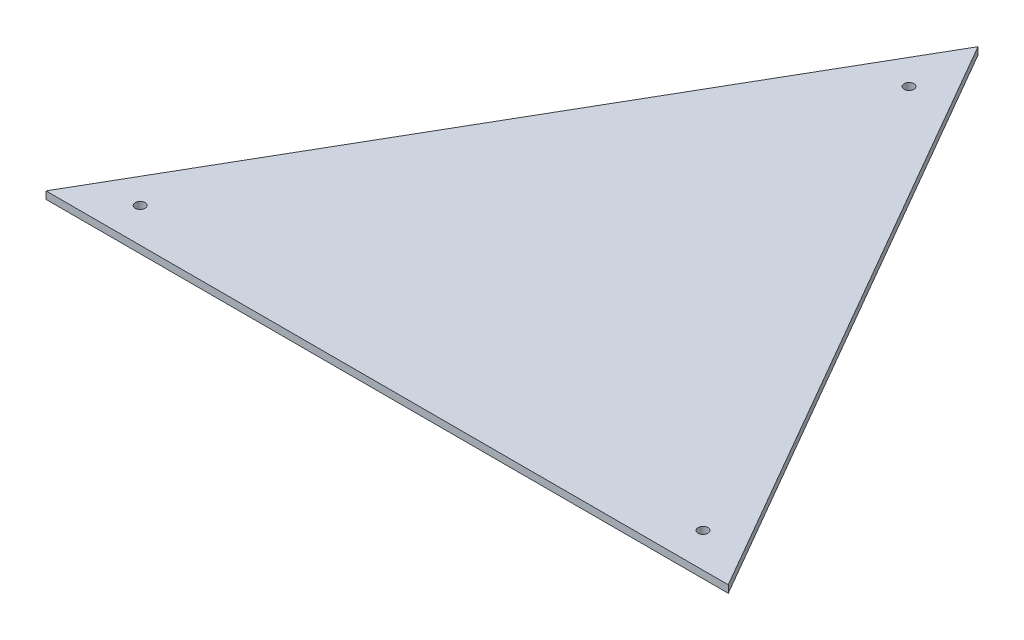
ISO-10303-21;
HEADER;
FILE_DESCRIPTION(('STEP AP214'),'2;1');
FILE_NAME('part.step','',(''),(''),'','','');
FILE_SCHEMA(('AUTOMOTIVE_DESIGN { 1 0 10303 214 1 1 1 1 }'));
ENDSEC;
DATA;
#1=APPLICATION_CONTEXT('core data for automotive mechanical design processes');
#2=APPLICATION_PROTOCOL_DEFINITION('international standard','automotive_design',2000,#1);
#3=PRODUCT_CONTEXT('',#1,'mechanical');
#4=PRODUCT('Part','Part','',(#3));
#5=PRODUCT_RELATED_PRODUCT_CATEGORY('part','',(#4));
#6=PRODUCT_DEFINITION_FORMATION('','',#4);
#7=PRODUCT_DEFINITION_CONTEXT('part definition',#1,'design');
#8=PRODUCT_DEFINITION('design','',#6,#7);
#9=PRODUCT_DEFINITION_SHAPE('','',#8);
#10=(LENGTH_UNIT() NAMED_UNIT(*) SI_UNIT(.MILLI.,.METRE.));
#11=(NAMED_UNIT(*) PLANE_ANGLE_UNIT() SI_UNIT($,.RADIAN.));
#12=(NAMED_UNIT(*) SI_UNIT($,.STERADIAN.) SOLID_ANGLE_UNIT());
#13=UNCERTAINTY_MEASURE_WITH_UNIT(LENGTH_MEASURE(1.E-05),#10,'distance_accuracy_value','');
#14=(GEOMETRIC_REPRESENTATION_CONTEXT(3) GLOBAL_UNCERTAINTY_ASSIGNED_CONTEXT((#13)) GLOBAL_UNIT_ASSIGNED_CONTEXT((#10,
#11,#12)) REPRESENTATION_CONTEXT('',''));
#15=CARTESIAN_POINT('',(0.,0.,0.));
#16=DIRECTION('',(0.,0.,1.));
#17=DIRECTION('',(1.,0.,0.));
#18=AXIS2_PLACEMENT_3D('',#15,#16,#17);
#19=CARTESIAN_POINT('',(219.970452561245,4.7625,126.999999999996));
#20=DIRECTION('',(-0.866025403784436,0.,0.500000000000004));
#21=DIRECTION('',(0.500000000000004,0.,0.866025403784436));
#22=AXIS2_PLACEMENT_3D('',#19,#20,#21);
#23=PLANE('',#22);
#24=DIRECTION('',(-0.500000000000004,0.,-0.866025403784436));
#25=VECTOR('',#24,1.);
#26=CARTESIAN_POINT('',(219.970452561245,0.,126.999999999996));
#27=LINE('',#26,#25);
#28=CARTESIAN_POINT('',(219.970452561245,0.,126.999999999996));
#29=VERTEX_POINT('',#28);
#30=CARTESIAN_POINT('',(0.,0.,-253.999999999996));
#31=VERTEX_POINT('',#30);
#32=EDGE_CURVE('E81',#29,#31,#27,.T.);
#33=ORIENTED_EDGE('',*,*,#32,.T.);
#34=DIRECTION('',(0.,-1.,0.));
#35=VECTOR('',#34,1.);
#36=CARTESIAN_POINT('',(0.,4.7625,-253.999999999996));
#37=LINE('',#36,#35);
#38=CARTESIAN_POINT('',(0.,4.7625,-253.999999999996));
#39=VERTEX_POINT('',#38);
#40=EDGE_CURVE('E11',#39,#31,#37,.T.);
#41=ORIENTED_EDGE('',*,*,#40,.F.);
#42=DIRECTION('',(-0.500000000000004,0.,-0.866025403784436));
#43=VECTOR('',#42,1.);
#44=CARTESIAN_POINT('',(219.970452561245,4.7625,126.999999999996));
#45=LINE('',#44,#43);
#46=CARTESIAN_POINT('',(219.970452561245,4.7625,126.999999999996));
#47=VERTEX_POINT('',#46);
#48=EDGE_CURVE('E74',#47,#39,#45,.T.);
#49=ORIENTED_EDGE('',*,*,#48,.F.);
#50=DIRECTION('',(0.,-1.,0.));
#51=VECTOR('',#50,1.);
#52=CARTESIAN_POINT('',(219.970452561245,4.7625,126.999999999996));
#53=LINE('',#52,#51);
#54=EDGE_CURVE('E82',#47,#29,#53,.T.);
#55=ORIENTED_EDGE('',*,*,#54,.T.);
#56=EDGE_LOOP('',(#33,#41,#49,#55));
#57=FACE_BOUND('',#56,.T.);
#58=ADVANCED_FACE('F34',(#57),#23,.F.);
#59=CARTESIAN_POINT('',(0.,4.7625,-253.999999999996));
#60=DIRECTION('',(0.86602540378444,0.,0.499999999999998));
#61=DIRECTION('',(0.499999999999998,0.,-0.86602540378444));
#62=AXIS2_PLACEMENT_3D('',#59,#60,#61);
#63=PLANE('',#62);
#64=DIRECTION('',(-0.499999999999998,0.,0.86602540378444));
#65=VECTOR('',#64,1.);
#66=CARTESIAN_POINT('',(0.,0.,-253.999999999996));
#67=LINE('',#66,#65);
#68=CARTESIAN_POINT('',(-219.970452561243,0.,126.999999999999));
#69=VERTEX_POINT('',#68);
#70=EDGE_CURVE('E62',#31,#69,#67,.T.);
#71=ORIENTED_EDGE('',*,*,#70,.T.);
#72=DIRECTION('',(0.,-1.,0.));
#73=VECTOR('',#72,1.);
#74=CARTESIAN_POINT('',(-219.970452561243,4.7625,126.999999999999));
#75=LINE('',#74,#73);
#76=CARTESIAN_POINT('',(-219.970452561243,4.7625,126.999999999999));
#77=VERTEX_POINT('',#76);
#78=EDGE_CURVE('E42',#77,#69,#75,.T.);
#79=ORIENTED_EDGE('',*,*,#78,.F.);
#80=DIRECTION('',(-0.499999999999998,0.,0.86602540378444));
#81=VECTOR('',#80,1.);
#82=CARTESIAN_POINT('',(0.,4.7625,-253.999999999996));
#83=LINE('',#82,#81);
#84=EDGE_CURVE('E70',#39,#77,#83,.T.);
#85=ORIENTED_EDGE('',*,*,#84,.F.);
#86=ORIENTED_EDGE('',*,*,#40,.T.);
#87=EDGE_LOOP('',(#71,#79,#85,#86));
#88=FACE_BOUND('',#87,.T.);
#89=ADVANCED_FACE('F71',(#88),#63,.F.);
#90=CARTESIAN_POINT('',(-219.970452561243,4.7625,126.999999999999));
#91=DIRECTION('',(0.,0.,-1.));
#92=DIRECTION('',(-1.,0.,0.));
#93=AXIS2_PLACEMENT_3D('',#90,#91,#92);
#94=PLANE('',#93);
#95=DIRECTION('',(1.,0.,0.));
#96=VECTOR('',#95,1.);
#97=CARTESIAN_POINT('',(-219.970452561243,0.,126.999999999999));
#98=LINE('',#97,#96);
#99=EDGE_CURVE('E67',#69,#29,#98,.T.);
#100=ORIENTED_EDGE('',*,*,#99,.T.);
#101=ORIENTED_EDGE('',*,*,#54,.F.);
#102=DIRECTION('',(1.,0.,0.));
#103=VECTOR('',#102,1.);
#104=CARTESIAN_POINT('',(-219.970452561243,4.7625,126.999999999999));
#105=LINE('',#104,#103);
#106=EDGE_CURVE('E50',#77,#47,#105,.T.);
#107=ORIENTED_EDGE('',*,*,#106,.F.);
#108=ORIENTED_EDGE('',*,*,#78,.T.);
#109=EDGE_LOOP('',(#100,#101,#107,#108));
#110=FACE_BOUND('',#109,.T.);
#111=ADVANCED_FACE('F93',(#110),#94,.F.);
#112=CARTESIAN_POINT('',(0.,4.7625,0.));
#113=DIRECTION('',(0.,1.,0.));
#114=DIRECTION('',(0.,0.,1.));
#115=AXIS2_PLACEMENT_3D('',#112,#113,#114);
#116=PLANE('',#115);
#117=CARTESIAN_POINT('',(1.19002030452009E-12,4.7625,-209.549999999998));
#118=DIRECTION('',(0.,1.,0.));
#119=DIRECTION('',(0.,0.,1.));
#120=AXIS2_PLACEMENT_3D('',#117,#118,#119);
#121=CIRCLE('',#120,3.175);
#122=CARTESIAN_POINT('',(1.19002030452009E-12,4.7625,-206.374999999998));
#123=VERTEX_POINT('',#122);
#124=EDGE_CURVE('E88',#123,#123,#121,.T.);
#125=ORIENTED_EDGE('',*,*,#124,.F.);
#126=EDGE_LOOP('',(#125));
#127=FACE_BOUND('',#126,.T.);
#128=CARTESIAN_POINT('',(-181.475623363026,4.7625,104.774999999999));
#129=DIRECTION('',(0.,1.,0.));
#130=DIRECTION('',(0.,0.,1.));
#131=AXIS2_PLACEMENT_3D('',#128,#129,#130);
#132=CIRCLE('',#131,3.175);
#133=CARTESIAN_POINT('',(-181.475623363026,4.7625,107.949999999999));
#134=VERTEX_POINT('',#133);
#135=EDGE_CURVE('E163',#134,#134,#132,.T.);
#136=ORIENTED_EDGE('',*,*,#135,.F.);
#137=EDGE_LOOP('',(#136));
#138=FACE_BOUND('',#137,.T.);
#139=CARTESIAN_POINT('',(181.475623363029,4.7625,104.774999999999));
#140=DIRECTION('',(0.,1.,0.));
#141=DIRECTION('',(0.,0.,1.));
#142=AXIS2_PLACEMENT_3D('',#139,#140,#141);
#143=CIRCLE('',#142,3.175);
#144=CARTESIAN_POINT('',(181.475623363029,4.7625,107.949999999999));
#145=VERTEX_POINT('',#144);
#146=EDGE_CURVE('E171',#145,#145,#143,.T.);
#147=ORIENTED_EDGE('',*,*,#146,.F.);
#148=EDGE_LOOP('',(#147));
#149=FACE_BOUND('',#148,.T.);
#150=ORIENTED_EDGE('',*,*,#48,.T.);
#151=ORIENTED_EDGE('',*,*,#84,.T.);
#152=ORIENTED_EDGE('',*,*,#106,.T.);
#153=EDGE_LOOP('',(#150,#151,#152));
#154=FACE_BOUND('',#153,.T.);
#155=ADVANCED_FACE('F77',(#127,#138,#149,#154),#116,.T.);
#156=CARTESIAN_POINT('',(0.,0.,0.));
#157=DIRECTION('',(0.,1.,0.));
#158=DIRECTION('',(0.,0.,1.));
#159=AXIS2_PLACEMENT_3D('',#156,#157,#158);
#160=PLANE('',#159);
#161=CARTESIAN_POINT('',(1.19002030452009E-12,0.,-209.549999999998));
#162=DIRECTION('',(0.,1.,0.));
#163=DIRECTION('',(0.,0.,1.));
#164=AXIS2_PLACEMENT_3D('',#161,#162,#163);
#165=CIRCLE('',#164,3.175);
#166=CARTESIAN_POINT('',(1.19002030452009E-12,0.,-206.374999999998));
#167=VERTEX_POINT('',#166);
#168=EDGE_CURVE('E84',#167,#167,#165,.T.);
#169=ORIENTED_EDGE('',*,*,#168,.T.);
#170=EDGE_LOOP('',(#169));
#171=FACE_BOUND('',#170,.T.);
#172=CARTESIAN_POINT('',(-181.475623363026,0.,104.774999999999));
#173=DIRECTION('',(0.,1.,0.));
#174=DIRECTION('',(0.,0.,1.));
#175=AXIS2_PLACEMENT_3D('',#172,#173,#174);
#176=CIRCLE('',#175,3.175);
#177=CARTESIAN_POINT('',(-181.475623363026,0.,107.949999999999));
#178=VERTEX_POINT('',#177);
#179=EDGE_CURVE('E160',#178,#178,#176,.T.);
#180=ORIENTED_EDGE('',*,*,#179,.T.);
#181=EDGE_LOOP('',(#180));
#182=FACE_BOUND('',#181,.T.);
#183=CARTESIAN_POINT('',(181.475623363029,0.,104.774999999999));
#184=DIRECTION('',(0.,1.,0.));
#185=DIRECTION('',(0.,0.,1.));
#186=AXIS2_PLACEMENT_3D('',#183,#184,#185);
#187=CIRCLE('',#186,3.175);
#188=CARTESIAN_POINT('',(181.475623363029,0.,107.949999999999));
#189=VERTEX_POINT('',#188);
#190=EDGE_CURVE('E168',#189,#189,#187,.T.);
#191=ORIENTED_EDGE('',*,*,#190,.T.);
#192=EDGE_LOOP('',(#191));
#193=FACE_BOUND('',#192,.T.);
#194=ORIENTED_EDGE('',*,*,#32,.F.);
#195=ORIENTED_EDGE('',*,*,#99,.F.);
#196=ORIENTED_EDGE('',*,*,#70,.F.);
#197=EDGE_LOOP('',(#194,#195,#196));
#198=FACE_BOUND('',#197,.T.);
#199=ADVANCED_FACE('F94',(#171,#182,#193,#198),#160,.F.);
#200=CARTESIAN_POINT('',(181.475623363029,0.,104.774999999999));
#201=DIRECTION('',(0.,1.,0.));
#202=DIRECTION('',(0.,0.,1.));
#203=AXIS2_PLACEMENT_3D('',#200,#201,#202);
#204=CYLINDRICAL_SURFACE('',#203,3.175);
#205=CARTESIAN_POINT('',(181.475623363029,0.,107.949999999999));
#206=CARTESIAN_POINT('',(181.475623363029,0.049609375,107.949999999999));
#207=CARTESIAN_POINT('',(181.475623363029,0.09921875,107.949999999999));
#208=CARTESIAN_POINT('',(181.475623363029,0.1984375,107.949999999999));
#209=CARTESIAN_POINT('',(181.475623363029,0.248046875,107.949999999999));
#210=CARTESIAN_POINT('',(181.475623363029,0.347265625,107.949999999999));
#211=CARTESIAN_POINT('',(181.475623363029,0.396875,107.949999999999));
#212=CARTESIAN_POINT('',(181.475623363029,0.49609375,107.949999999999));
#213=CARTESIAN_POINT('',(181.475623363029,0.545703125,107.949999999999));
#214=CARTESIAN_POINT('',(181.475623363029,0.644921875,107.949999999999));
#215=CARTESIAN_POINT('',(181.475623363029,0.69453125,107.949999999999));
#216=CARTESIAN_POINT('',(181.475623363029,0.79375,107.949999999999));
#217=CARTESIAN_POINT('',(181.475623363029,0.843359375,107.949999999999));
#218=CARTESIAN_POINT('',(181.475623363029,0.942578125,107.949999999999));
#219=CARTESIAN_POINT('',(181.475623363029,0.9921875,107.949999999999));
#220=CARTESIAN_POINT('',(181.475623363029,1.09140625,107.949999999999));
#221=CARTESIAN_POINT('',(181.475623363029,1.141015625,107.949999999999));
#222=CARTESIAN_POINT('',(181.475623363029,1.240234375,107.949999999999));
#223=CARTESIAN_POINT('',(181.475623363029,1.28984375,107.949999999999));
#224=CARTESIAN_POINT('',(181.475623363029,1.3890625,107.949999999999));
#225=CARTESIAN_POINT('',(181.475623363029,1.438671875,107.949999999999));
#226=CARTESIAN_POINT('',(181.475623363029,1.537890625,107.949999999999));
#227=CARTESIAN_POINT('',(181.475623363029,1.5875,107.949999999999));
#228=CARTESIAN_POINT('',(181.475623363029,1.68671875,107.949999999999));
#229=CARTESIAN_POINT('',(181.475623363029,1.736328125,107.949999999999));
#230=CARTESIAN_POINT('',(181.475623363029,1.835546875,107.949999999999));
#231=CARTESIAN_POINT('',(181.475623363029,1.88515625,107.949999999999));
#232=CARTESIAN_POINT('',(181.475623363029,1.984375,107.949999999999));
#233=CARTESIAN_POINT('',(181.475623363029,2.033984375,107.949999999999));
#234=CARTESIAN_POINT('',(181.475623363029,2.133203125,107.949999999999));
#235=CARTESIAN_POINT('',(181.475623363029,2.1828125,107.949999999999));
#236=CARTESIAN_POINT('',(181.475623363029,2.28203125,107.949999999999));
#237=CARTESIAN_POINT('',(181.475623363029,2.331640625,107.949999999999));
#238=CARTESIAN_POINT('',(181.475623363029,2.430859375,107.949999999999));
#239=CARTESIAN_POINT('',(181.475623363029,2.48046875,107.949999999999));
#240=CARTESIAN_POINT('',(181.475623363029,2.5796875,107.949999999999));
#241=CARTESIAN_POINT('',(181.475623363029,2.629296875,107.949999999999));
#242=CARTESIAN_POINT('',(181.475623363029,2.728515625,107.949999999999));
#243=CARTESIAN_POINT('',(181.475623363029,2.778125,107.949999999999));
#244=CARTESIAN_POINT('',(181.475623363029,2.87734375,107.949999999999));
#245=CARTESIAN_POINT('',(181.475623363029,2.926953125,107.949999999999));
#246=CARTESIAN_POINT('',(181.475623363029,3.026171875,107.949999999999));
#247=CARTESIAN_POINT('',(181.475623363029,3.07578125,107.949999999999));
#248=CARTESIAN_POINT('',(181.475623363029,3.175,107.949999999999));
#249=CARTESIAN_POINT('',(181.475623363029,3.224609375,107.949999999999));
#250=CARTESIAN_POINT('',(181.475623363029,3.323828125,107.949999999999));
#251=CARTESIAN_POINT('',(181.475623363029,3.3734375,107.949999999999));
#252=CARTESIAN_POINT('',(181.475623363029,3.47265625,107.949999999999));
#253=CARTESIAN_POINT('',(181.475623363029,3.522265625,107.949999999999));
#254=CARTESIAN_POINT('',(181.475623363029,3.621484375,107.949999999999));
#255=CARTESIAN_POINT('',(181.475623363029,3.67109375,107.949999999999));
#256=CARTESIAN_POINT('',(181.475623363029,3.7703125,107.949999999999));
#257=CARTESIAN_POINT('',(181.475623363029,3.819921875,107.949999999999));
#258=CARTESIAN_POINT('',(181.475623363029,3.919140625,107.949999999999));
#259=CARTESIAN_POINT('',(181.475623363029,3.96875,107.949999999999));
#260=CARTESIAN_POINT('',(181.475623363029,4.06796875,107.949999999999));
#261=CARTESIAN_POINT('',(181.475623363029,4.117578125,107.949999999999));
#262=CARTESIAN_POINT('',(181.475623363029,4.216796875,107.949999999999));
#263=CARTESIAN_POINT('',(181.475623363029,4.26640625,107.949999999999));
#264=CARTESIAN_POINT('',(181.475623363029,4.365625,107.949999999999));
#265=CARTESIAN_POINT('',(181.475623363029,4.415234375,107.949999999999));
#266=CARTESIAN_POINT('',(181.475623363029,4.514453125,107.949999999999));
#267=CARTESIAN_POINT('',(181.475623363029,4.5640625,107.949999999999));
#268=CARTESIAN_POINT('',(181.475623363029,4.66328125,107.949999999999));
#269=CARTESIAN_POINT('',(181.475623363029,4.712890625,107.949999999999));
#270=CARTESIAN_POINT('',(181.475623363029,4.7625,107.949999999999));
#271=B_SPLINE_CURVE_WITH_KNOTS('',3,(#205,#206,#207,#208,#209,#210,#211,#212,#213,#214,#215,
#216,#217,#218,#219,#220,#221,#222,#223,#224,#225,#226,#227,#228,#229,#230,#231,#232,#233,#234,
#235,#236,#237,#238,#239,#240,#241,#242,#243,#244,#245,#246,#247,#248,#249,#250,#251,#252,#253,
#254,#255,#256,#257,#258,#259,#260,#261,#262,#263,#264,#265,#266,#267,#268,#269,#270),
.UNSPECIFIED.,.F.,.F.,(4,2,2,2,2,2,2,2,2,2,2,2,2,2,2,2,2,2,2,2,2,2,2,2,2,2,2,2,2,2,2,2,4),(0.,
0.148828125,0.29765625,0.446484375,0.5953125,0.744140625,0.89296875,1.041796875,1.190625,
1.339453125,1.48828125,1.637109375,1.7859375,1.934765625,2.08359375,2.232421875,2.38125,
2.530078125,2.67890625,2.827734375,2.9765625,3.125390625,3.27421875,3.423046875,3.571875,
3.720703125,3.86953125,4.018359375,4.1671875,4.316015625,4.46484375,4.613671875,4.7625),.UNSPECIFIED.);
#272=EDGE_CURVE('BSEAM96',#189,#145,#271,.T.);
#273=ORIENTED_EDGE('',*,*,#190,.F.);
#274=ORIENTED_EDGE('',*,*,#146,.T.);
#275=ORIENTED_EDGE('',*,*,#272,.T.);
#276=ORIENTED_EDGE('',*,*,#272,.F.);
#277=EDGE_LOOP('',(#273,#275,#274,#276));
#278=FACE_BOUND('',#277,.T.);
#279=ADVANCED_FACE('F96',(#278),#204,.F.);
#280=CARTESIAN_POINT('',(-181.475623363026,0.,104.774999999999));
#281=DIRECTION('',(0.,1.,0.));
#282=DIRECTION('',(0.,0.,1.));
#283=AXIS2_PLACEMENT_3D('',#280,#281,#282);
#284=CYLINDRICAL_SURFACE('',#283,3.175);
#285=CARTESIAN_POINT('',(-181.475623363026,0.,107.949999999999));
#286=CARTESIAN_POINT('',(-181.475623363026,0.049609375,107.949999999999));
#287=CARTESIAN_POINT('',(-181.475623363026,0.09921875,107.949999999999));
#288=CARTESIAN_POINT('',(-181.475623363026,0.1984375,107.949999999999));
#289=CARTESIAN_POINT('',(-181.475623363026,0.248046875,107.949999999999));
#290=CARTESIAN_POINT('',(-181.475623363026,0.347265625,107.949999999999));
#291=CARTESIAN_POINT('',(-181.475623363026,0.396875,107.949999999999));
#292=CARTESIAN_POINT('',(-181.475623363026,0.49609375,107.949999999999));
#293=CARTESIAN_POINT('',(-181.475623363026,0.545703125,107.949999999999));
#294=CARTESIAN_POINT('',(-181.475623363026,0.644921875,107.949999999999));
#295=CARTESIAN_POINT('',(-181.475623363026,0.69453125,107.949999999999));
#296=CARTESIAN_POINT('',(-181.475623363026,0.79375,107.949999999999));
#297=CARTESIAN_POINT('',(-181.475623363026,0.843359375,107.949999999999));
#298=CARTESIAN_POINT('',(-181.475623363026,0.942578125,107.949999999999));
#299=CARTESIAN_POINT('',(-181.475623363026,0.9921875,107.949999999999));
#300=CARTESIAN_POINT('',(-181.475623363026,1.09140625,107.949999999999));
#301=CARTESIAN_POINT('',(-181.475623363026,1.141015625,107.949999999999));
#302=CARTESIAN_POINT('',(-181.475623363026,1.240234375,107.949999999999));
#303=CARTESIAN_POINT('',(-181.475623363026,1.28984375,107.949999999999));
#304=CARTESIAN_POINT('',(-181.475623363026,1.3890625,107.949999999999));
#305=CARTESIAN_POINT('',(-181.475623363026,1.438671875,107.949999999999));
#306=CARTESIAN_POINT('',(-181.475623363026,1.537890625,107.949999999999));
#307=CARTESIAN_POINT('',(-181.475623363026,1.5875,107.949999999999));
#308=CARTESIAN_POINT('',(-181.475623363026,1.68671875,107.949999999999));
#309=CARTESIAN_POINT('',(-181.475623363026,1.736328125,107.949999999999));
#310=CARTESIAN_POINT('',(-181.475623363026,1.835546875,107.949999999999));
#311=CARTESIAN_POINT('',(-181.475623363026,1.88515625,107.949999999999));
#312=CARTESIAN_POINT('',(-181.475623363026,1.984375,107.949999999999));
#313=CARTESIAN_POINT('',(-181.475623363026,2.033984375,107.949999999999));
#314=CARTESIAN_POINT('',(-181.475623363026,2.133203125,107.949999999999));
#315=CARTESIAN_POINT('',(-181.475623363026,2.1828125,107.949999999999));
#316=CARTESIAN_POINT('',(-181.475623363026,2.28203125,107.949999999999));
#317=CARTESIAN_POINT('',(-181.475623363026,2.331640625,107.949999999999));
#318=CARTESIAN_POINT('',(-181.475623363026,2.430859375,107.949999999999));
#319=CARTESIAN_POINT('',(-181.475623363026,2.48046875,107.949999999999));
#320=CARTESIAN_POINT('',(-181.475623363026,2.5796875,107.949999999999));
#321=CARTESIAN_POINT('',(-181.475623363026,2.629296875,107.949999999999));
#322=CARTESIAN_POINT('',(-181.475623363026,2.728515625,107.949999999999));
#323=CARTESIAN_POINT('',(-181.475623363026,2.778125,107.949999999999));
#324=CARTESIAN_POINT('',(-181.475623363026,2.87734375,107.949999999999));
#325=CARTESIAN_POINT('',(-181.475623363026,2.926953125,107.949999999999));
#326=CARTESIAN_POINT('',(-181.475623363026,3.026171875,107.949999999999));
#327=CARTESIAN_POINT('',(-181.475623363026,3.07578125,107.949999999999));
#328=CARTESIAN_POINT('',(-181.475623363026,3.175,107.949999999999));
#329=CARTESIAN_POINT('',(-181.475623363026,3.224609375,107.949999999999));
#330=CARTESIAN_POINT('',(-181.475623363026,3.323828125,107.949999999999));
#331=CARTESIAN_POINT('',(-181.475623363026,3.3734375,107.949999999999));
#332=CARTESIAN_POINT('',(-181.475623363026,3.47265625,107.949999999999));
#333=CARTESIAN_POINT('',(-181.475623363026,3.522265625,107.949999999999));
#334=CARTESIAN_POINT('',(-181.475623363026,3.621484375,107.949999999999));
#335=CARTESIAN_POINT('',(-181.475623363026,3.67109375,107.949999999999));
#336=CARTESIAN_POINT('',(-181.475623363026,3.7703125,107.949999999999));
#337=CARTESIAN_POINT('',(-181.475623363026,3.819921875,107.949999999999));
#338=CARTESIAN_POINT('',(-181.475623363026,3.919140625,107.949999999999));
#339=CARTESIAN_POINT('',(-181.475623363026,3.96875,107.949999999999));
#340=CARTESIAN_POINT('',(-181.475623363026,4.06796875,107.949999999999));
#341=CARTESIAN_POINT('',(-181.475623363026,4.117578125,107.949999999999));
#342=CARTESIAN_POINT('',(-181.475623363026,4.216796875,107.949999999999));
#343=CARTESIAN_POINT('',(-181.475623363026,4.26640625,107.949999999999));
#344=CARTESIAN_POINT('',(-181.475623363026,4.365625,107.949999999999));
#345=CARTESIAN_POINT('',(-181.475623363026,4.415234375,107.949999999999));
#346=CARTESIAN_POINT('',(-181.475623363026,4.514453125,107.949999999999));
#347=CARTESIAN_POINT('',(-181.475623363026,4.5640625,107.949999999999));
#348=CARTESIAN_POINT('',(-181.475623363026,4.66328125,107.949999999999));
#349=CARTESIAN_POINT('',(-181.475623363026,4.712890625,107.949999999999));
#350=CARTESIAN_POINT('',(-181.475623363026,4.7625,107.949999999999));
#351=B_SPLINE_CURVE_WITH_KNOTS('',3,(#285,#286,#287,#288,#289,#290,#291,#292,#293,#294,#295,
#296,#297,#298,#299,#300,#301,#302,#303,#304,#305,#306,#307,#308,#309,#310,#311,#312,#313,#314,
#315,#316,#317,#318,#319,#320,#321,#322,#323,#324,#325,#326,#327,#328,#329,#330,#331,#332,#333,
#334,#335,#336,#337,#338,#339,#340,#341,#342,#343,#344,#345,#346,#347,#348,#349,#350),
.UNSPECIFIED.,.F.,.F.,(4,2,2,2,2,2,2,2,2,2,2,2,2,2,2,2,2,2,2,2,2,2,2,2,2,2,2,2,2,2,2,2,4),(0.,
0.148828125,0.29765625,0.446484375,0.5953125,0.744140625,0.89296875,1.041796875,1.190625,
1.339453125,1.48828125,1.637109375,1.7859375,1.934765625,2.08359375,2.232421875,2.38125,
2.530078125,2.67890625,2.827734375,2.9765625,3.125390625,3.27421875,3.423046875,3.571875,
3.720703125,3.86953125,4.018359375,4.1671875,4.316015625,4.46484375,4.613671875,4.7625),.UNSPECIFIED.);
#352=EDGE_CURVE('BSEAM104',#178,#134,#351,.T.);
#353=ORIENTED_EDGE('',*,*,#179,.F.);
#354=ORIENTED_EDGE('',*,*,#135,.T.);
#355=ORIENTED_EDGE('',*,*,#352,.T.);
#356=ORIENTED_EDGE('',*,*,#352,.F.);
#357=EDGE_LOOP('',(#353,#355,#354,#356));
#358=FACE_BOUND('',#357,.T.);
#359=ADVANCED_FACE('F104',(#358),#284,.F.);
#360=CARTESIAN_POINT('',(1.19002030452009E-12,0.,-209.549999999998));
#361=DIRECTION('',(0.,1.,0.));
#362=DIRECTION('',(0.,0.,1.));
#363=AXIS2_PLACEMENT_3D('',#360,#361,#362);
#364=CYLINDRICAL_SURFACE('',#363,3.175);
#365=CARTESIAN_POINT('',(1.19002030452009E-12,0.,-206.374999999998));
#366=CARTESIAN_POINT('',(1.19002030452009E-12,0.049609375,-206.374999999998));
#367=CARTESIAN_POINT('',(1.19002030452009E-12,0.09921875,-206.374999999998));
#368=CARTESIAN_POINT('',(1.19002030452009E-12,0.1984375,-206.374999999998));
#369=CARTESIAN_POINT('',(1.19002030452009E-12,0.248046875,-206.374999999998));
#370=CARTESIAN_POINT('',(1.19002030452009E-12,0.347265625,-206.374999999998));
#371=CARTESIAN_POINT('',(1.19002030452009E-12,0.396875,-206.374999999998));
#372=CARTESIAN_POINT('',(1.19002030452009E-12,0.49609375,-206.374999999998));
#373=CARTESIAN_POINT('',(1.19002030452009E-12,0.545703125,-206.374999999998));
#374=CARTESIAN_POINT('',(1.19002030452009E-12,0.644921875,-206.374999999998));
#375=CARTESIAN_POINT('',(1.19002030452009E-12,0.69453125,-206.374999999998));
#376=CARTESIAN_POINT('',(1.19002030452009E-12,0.79375,-206.374999999998));
#377=CARTESIAN_POINT('',(1.19002030452009E-12,0.843359375,-206.374999999998));
#378=CARTESIAN_POINT('',(1.19002030452009E-12,0.942578125,-206.374999999998));
#379=CARTESIAN_POINT('',(1.19002030452009E-12,0.9921875,-206.374999999998));
#380=CARTESIAN_POINT('',(1.19002030452009E-12,1.09140625,-206.374999999998));
#381=CARTESIAN_POINT('',(1.19002030452009E-12,1.141015625,-206.374999999998));
#382=CARTESIAN_POINT('',(1.19002030452009E-12,1.240234375,-206.374999999998));
#383=CARTESIAN_POINT('',(1.19002030452009E-12,1.28984375,-206.374999999998));
#384=CARTESIAN_POINT('',(1.19002030452009E-12,1.3890625,-206.374999999998));
#385=CARTESIAN_POINT('',(1.19002030452009E-12,1.438671875,-206.374999999998));
#386=CARTESIAN_POINT('',(1.19002030452009E-12,1.537890625,-206.374999999998));
#387=CARTESIAN_POINT('',(1.19002030452009E-12,1.5875,-206.374999999998));
#388=CARTESIAN_POINT('',(1.19002030452009E-12,1.68671875,-206.374999999998));
#389=CARTESIAN_POINT('',(1.19002030452009E-12,1.736328125,-206.374999999998));
#390=CARTESIAN_POINT('',(1.19002030452009E-12,1.835546875,-206.374999999998));
#391=CARTESIAN_POINT('',(1.19002030452009E-12,1.88515625,-206.374999999998));
#392=CARTESIAN_POINT('',(1.19002030452009E-12,1.984375,-206.374999999998));
#393=CARTESIAN_POINT('',(1.19002030452009E-12,2.033984375,-206.374999999998));
#394=CARTESIAN_POINT('',(1.19002030452009E-12,2.133203125,-206.374999999998));
#395=CARTESIAN_POINT('',(1.19002030452009E-12,2.1828125,-206.374999999998));
#396=CARTESIAN_POINT('',(1.19002030452009E-12,2.28203125,-206.374999999998));
#397=CARTESIAN_POINT('',(1.19002030452009E-12,2.331640625,-206.374999999998));
#398=CARTESIAN_POINT('',(1.19002030452009E-12,2.430859375,-206.374999999998));
#399=CARTESIAN_POINT('',(1.19002030452009E-12,2.48046875,-206.374999999998));
#400=CARTESIAN_POINT('',(1.19002030452009E-12,2.5796875,-206.374999999998));
#401=CARTESIAN_POINT('',(1.19002030452009E-12,2.629296875,-206.374999999998));
#402=CARTESIAN_POINT('',(1.19002030452009E-12,2.728515625,-206.374999999998));
#403=CARTESIAN_POINT('',(1.19002030452009E-12,2.778125,-206.374999999998));
#404=CARTESIAN_POINT('',(1.19002030452009E-12,2.87734375,-206.374999999998));
#405=CARTESIAN_POINT('',(1.19002030452009E-12,2.926953125,-206.374999999998));
#406=CARTESIAN_POINT('',(1.19002030452009E-12,3.026171875,-206.374999999998));
#407=CARTESIAN_POINT('',(1.19002030452009E-12,3.07578125,-206.374999999998));
#408=CARTESIAN_POINT('',(1.19002030452009E-12,3.175,-206.374999999998));
#409=CARTESIAN_POINT('',(1.19002030452009E-12,3.224609375,-206.374999999998));
#410=CARTESIAN_POINT('',(1.19002030452009E-12,3.323828125,-206.374999999998));
#411=CARTESIAN_POINT('',(1.19002030452009E-12,3.3734375,-206.374999999998));
#412=CARTESIAN_POINT('',(1.19002030452009E-12,3.47265625,-206.374999999998));
#413=CARTESIAN_POINT('',(1.19002030452009E-12,3.522265625,-206.374999999998));
#414=CARTESIAN_POINT('',(1.19002030452009E-12,3.621484375,-206.374999999998));
#415=CARTESIAN_POINT('',(1.19002030452009E-12,3.67109375,-206.374999999998));
#416=CARTESIAN_POINT('',(1.19002030452009E-12,3.7703125,-206.374999999998));
#417=CARTESIAN_POINT('',(1.19002030452009E-12,3.819921875,-206.374999999998));
#418=CARTESIAN_POINT('',(1.19002030452009E-12,3.919140625,-206.374999999998));
#419=CARTESIAN_POINT('',(1.19002030452009E-12,3.96875,-206.374999999998));
#420=CARTESIAN_POINT('',(1.19002030452009E-12,4.06796875,-206.374999999998));
#421=CARTESIAN_POINT('',(1.19002030452009E-12,4.117578125,-206.374999999998));
#422=CARTESIAN_POINT('',(1.19002030452009E-12,4.216796875,-206.374999999998));
#423=CARTESIAN_POINT('',(1.19002030452009E-12,4.26640625,-206.374999999998));
#424=CARTESIAN_POINT('',(1.19002030452009E-12,4.365625,-206.374999999998));
#425=CARTESIAN_POINT('',(1.19002030452009E-12,4.415234375,-206.374999999998));
#426=CARTESIAN_POINT('',(1.19002030452009E-12,4.514453125,-206.374999999998));
#427=CARTESIAN_POINT('',(1.19002030452009E-12,4.5640625,-206.374999999998));
#428=CARTESIAN_POINT('',(1.19002030452009E-12,4.66328125,-206.374999999998));
#429=CARTESIAN_POINT('',(1.19002030452009E-12,4.712890625,-206.374999999998));
#430=CARTESIAN_POINT('',(1.19002030452009E-12,4.7625,-206.374999999998));
#431=B_SPLINE_CURVE_WITH_KNOTS('',3,(#365,#366,#367,#368,#369,#370,#371,#372,#373,#374,#375,
#376,#377,#378,#379,#380,#381,#382,#383,#384,#385,#386,#387,#388,#389,#390,#391,#392,#393,#394,
#395,#396,#397,#398,#399,#400,#401,#402,#403,#404,#405,#406,#407,#408,#409,#410,#411,#412,#413,
#414,#415,#416,#417,#418,#419,#420,#421,#422,#423,#424,#425,#426,#427,#428,#429,#430),
.UNSPECIFIED.,.F.,.F.,(4,2,2,2,2,2,2,2,2,2,2,2,2,2,2,2,2,2,2,2,2,2,2,2,2,2,2,2,2,2,2,2,4),(0.,
0.148828125,0.29765625,0.446484375,0.5953125,0.744140625,0.89296875,1.041796875,1.190625,
1.339453125,1.48828125,1.637109375,1.7859375,1.934765625,2.08359375,2.232421875,2.38125,
2.530078125,2.67890625,2.827734375,2.9765625,3.125390625,3.27421875,3.423046875,3.571875,
3.720703125,3.86953125,4.018359375,4.1671875,4.316015625,4.46484375,4.613671875,4.7625),.UNSPECIFIED.);
#432=EDGE_CURVE('BSEAM139',#167,#123,#431,.T.);
#433=ORIENTED_EDGE('',*,*,#168,.F.);
#434=ORIENTED_EDGE('',*,*,#124,.T.);
#435=ORIENTED_EDGE('',*,*,#432,.T.);
#436=ORIENTED_EDGE('',*,*,#432,.F.);
#437=EDGE_LOOP('',(#433,#435,#434,#436));
#438=FACE_BOUND('',#437,.T.);
#439=ADVANCED_FACE('F139',(#438),#364,.F.);
#440=CLOSED_SHELL('',(#58,#89,#111,#155,#199,#279,#359,#439));
#441=MANIFOLD_SOLID_BREP('B2',#440);
#442=ADVANCED_BREP_SHAPE_REPRESENTATION('',(#18,#441),#14);
#443=SHAPE_DEFINITION_REPRESENTATION(#9,#442);
ENDSEC;
END-ISO-10303-21;
